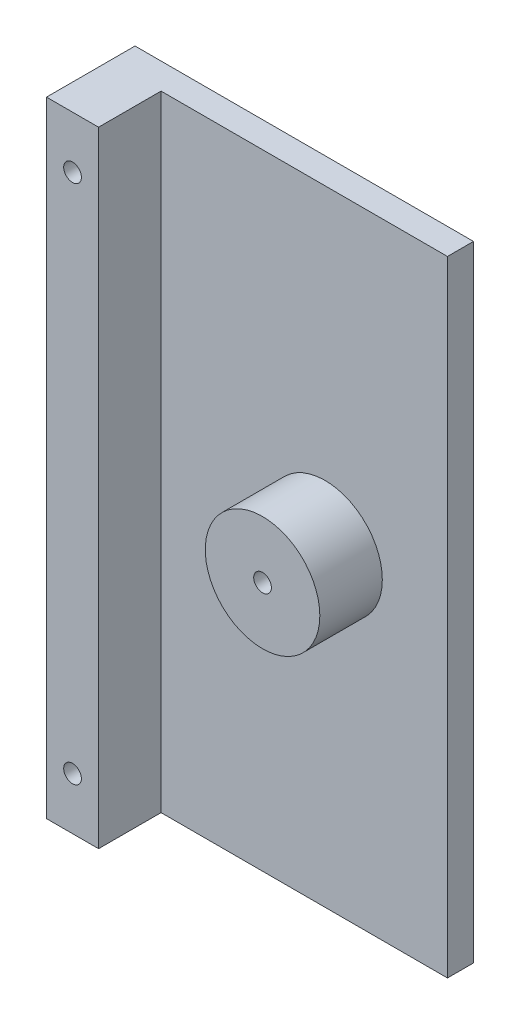
ISO-10303-21;
HEADER;
FILE_DESCRIPTION(('STEP AP214'),'2;1');
FILE_NAME('part.step','',(''),(''),'','','');
FILE_SCHEMA(('AUTOMOTIVE_DESIGN { 1 0 10303 214 1 1 1 1 }'));
ENDSEC;
DATA;
#1=APPLICATION_CONTEXT('core data for automotive mechanical design processes');
#2=APPLICATION_PROTOCOL_DEFINITION('international standard','automotive_design',2000,#1);
#3=PRODUCT_CONTEXT('',#1,'mechanical');
#4=PRODUCT('Part','Part','',(#3));
#5=PRODUCT_RELATED_PRODUCT_CATEGORY('part','',(#4));
#6=PRODUCT_DEFINITION_FORMATION('','',#4);
#7=PRODUCT_DEFINITION_CONTEXT('part definition',#1,'design');
#8=PRODUCT_DEFINITION('design','',#6,#7);
#9=PRODUCT_DEFINITION_SHAPE('','',#8);
#10=(LENGTH_UNIT() NAMED_UNIT(*) SI_UNIT(.MILLI.,.METRE.));
#11=(NAMED_UNIT(*) PLANE_ANGLE_UNIT() SI_UNIT($,.RADIAN.));
#12=(NAMED_UNIT(*) SI_UNIT($,.STERADIAN.) SOLID_ANGLE_UNIT());
#13=UNCERTAINTY_MEASURE_WITH_UNIT(LENGTH_MEASURE(1.E-05),#10,'distance_accuracy_value','');
#14=(GEOMETRIC_REPRESENTATION_CONTEXT(3) GLOBAL_UNCERTAINTY_ASSIGNED_CONTEXT((#13)) GLOBAL_UNIT_ASSIGNED_CONTEXT((#10,
#11,#12)) REPRESENTATION_CONTEXT('',''));
#15=CARTESIAN_POINT('',(0.,0.,0.));
#16=DIRECTION('',(0.,0.,1.));
#17=DIRECTION('',(1.,0.,0.));
#18=AXIS2_PLACEMENT_3D('',#15,#16,#17);
#19=CARTESIAN_POINT('',(8.99,0.,0.));
#20=DIRECTION('',(0.,0.,1.));
#21=DIRECTION('',(1.,0.,0.));
#22=AXIS2_PLACEMENT_3D('',#19,#20,#21);
#23=CYLINDRICAL_SURFACE('',#22,1.7);
#24=CARTESIAN_POINT('',(8.99,0.,17.));
#25=DIRECTION('',(0.,0.,1.));
#26=DIRECTION('',(1.,0.,0.));
#27=AXIS2_PLACEMENT_3D('',#24,#25,#26);
#28=CIRCLE('',#27,1.7);
#29=CARTESIAN_POINT('',(10.69,0.,17.));
#30=VERTEX_POINT('',#29);
#31=EDGE_CURVE('E186',#30,#30,#28,.T.);
#32=ORIENTED_EDGE('',*,*,#31,.T.);
#33=EDGE_LOOP('',(#32));
#34=FACE_BOUND('',#33,.T.);
#35=CARTESIAN_POINT('',(8.99,0.,2.6));
#36=DIRECTION('',(0.,0.,-1.));
#37=DIRECTION('',(-1.,0.,0.));
#38=AXIS2_PLACEMENT_3D('',#35,#36,#37);
#39=CIRCLE('',#38,1.7);
#40=CARTESIAN_POINT('',(7.29,0.,2.6));
#41=VERTEX_POINT('',#40);
#42=EDGE_CURVE('E45',#41,#41,#39,.F.);
#43=ORIENTED_EDGE('',*,*,#42,.F.);
#44=EDGE_LOOP('',(#43));
#45=FACE_BOUND('',#44,.T.);
#46=ADVANCED_FACE('F41',(#34,#45),#23,.F.);
#47=CARTESIAN_POINT('',(32.5,-60.,5.));
#48=DIRECTION('',(0.,1.,0.));
#49=DIRECTION('',(0.,0.,1.));
#50=AXIS2_PLACEMENT_3D('',#47,#48,#49);
#51=PLANE('',#50);
#52=DIRECTION('',(1.,0.,0.));
#53=VECTOR('',#52,1.);
#54=CARTESIAN_POINT('',(32.5,-60.,0.));
#55=LINE('',#54,#53);
#56=CARTESIAN_POINT('',(-32.5,-60.,0.));
#57=VERTEX_POINT('',#56);
#58=CARTESIAN_POINT('',(32.5,-60.,0.));
#59=VERTEX_POINT('',#58);
#60=EDGE_CURVE('E224',#57,#59,#55,.T.);
#61=ORIENTED_EDGE('',*,*,#60,.T.);
#62=DIRECTION('',(0.,0.,-1.));
#63=VECTOR('',#62,1.);
#64=CARTESIAN_POINT('',(32.5,-60.,5.));
#65=LINE('',#64,#63);
#66=CARTESIAN_POINT('',(32.5,-60.,5.));
#67=VERTEX_POINT('',#66);
#68=EDGE_CURVE('E11',#67,#59,#65,.T.);
#69=ORIENTED_EDGE('',*,*,#68,.F.);
#70=DIRECTION('',(1.,0.,0.));
#71=VECTOR('',#70,1.);
#72=CARTESIAN_POINT('',(32.5,-60.,5.));
#73=LINE('',#72,#71);
#74=CARTESIAN_POINT('',(-22.5,-60.,5.));
#75=VERTEX_POINT('',#74);
#76=EDGE_CURVE('E225',#75,#67,#73,.T.);
#77=ORIENTED_EDGE('',*,*,#76,.F.);
#78=DIRECTION('',(0.,0.,-1.));
#79=VECTOR('',#78,1.);
#80=CARTESIAN_POINT('',(-22.5,-60.,17.));
#81=LINE('',#80,#79);
#82=CARTESIAN_POINT('',(-22.5,-60.,17.));
#83=VERTEX_POINT('',#82);
#84=EDGE_CURVE('E221',#83,#75,#81,.T.);
#85=ORIENTED_EDGE('',*,*,#84,.F.);
#86=DIRECTION('',(1.,0.,0.));
#87=VECTOR('',#86,1.);
#88=CARTESIAN_POINT('',(-32.5,-60.,17.));
#89=LINE('',#88,#87);
#90=CARTESIAN_POINT('',(-32.5,-60.,17.));
#91=VERTEX_POINT('',#90);
#92=EDGE_CURVE('E210',#91,#83,#89,.T.);
#93=ORIENTED_EDGE('',*,*,#92,.F.);
#94=DIRECTION('',(0.,0.,-1.));
#95=VECTOR('',#94,1.);
#96=CARTESIAN_POINT('',(-32.5,-60.,5.));
#97=LINE('',#96,#95);
#98=EDGE_CURVE('E232',#91,#57,#97,.T.);
#99=ORIENTED_EDGE('',*,*,#98,.T.);
#100=EDGE_LOOP('',(#61,#69,#77,#85,#93,#99));
#101=FACE_BOUND('',#100,.T.);
#102=ADVANCED_FACE('F43',(#101),#51,.F.);
#103=CARTESIAN_POINT('',(32.5,60.,5.));
#104=DIRECTION('',(-1.,0.,0.));
#105=DIRECTION('',(0.,-1.,0.));
#106=AXIS2_PLACEMENT_3D('',#103,#104,#105);
#107=PLANE('',#106);
#108=DIRECTION('',(0.,1.,0.));
#109=VECTOR('',#108,1.);
#110=CARTESIAN_POINT('',(32.5,60.,0.));
#111=LINE('',#110,#109);
#112=CARTESIAN_POINT('',(32.5,60.,0.));
#113=VERTEX_POINT('',#112);
#114=EDGE_CURVE('E235',#59,#113,#111,.T.);
#115=ORIENTED_EDGE('',*,*,#114,.T.);
#116=DIRECTION('',(0.,0.,-1.));
#117=VECTOR('',#116,1.);
#118=CARTESIAN_POINT('',(32.5,60.,5.));
#119=LINE('',#118,#117);
#120=CARTESIAN_POINT('',(32.5,60.,5.));
#121=VERTEX_POINT('',#120);
#122=EDGE_CURVE('E50',#121,#113,#119,.T.);
#123=ORIENTED_EDGE('',*,*,#122,.F.);
#124=DIRECTION('',(0.,1.,0.));
#125=VECTOR('',#124,1.);
#126=CARTESIAN_POINT('',(32.5,60.,5.));
#127=LINE('',#126,#125);
#128=EDGE_CURVE('E227',#67,#121,#127,.T.);
#129=ORIENTED_EDGE('',*,*,#128,.F.);
#130=ORIENTED_EDGE('',*,*,#68,.T.);
#131=EDGE_LOOP('',(#115,#123,#129,#130));
#132=FACE_BOUND('',#131,.T.);
#133=ADVANCED_FACE('F293',(#132),#107,.F.);
#134=CARTESIAN_POINT('',(32.5,60.,5.));
#135=DIRECTION('',(0.,-1.,0.));
#136=DIRECTION('',(1.,0.,0.));
#137=AXIS2_PLACEMENT_3D('',#134,#135,#136);
#138=PLANE('',#137);
#139=DIRECTION('',(-1.,0.,0.));
#140=VECTOR('',#139,1.);
#141=CARTESIAN_POINT('',(32.5,60.,0.));
#142=LINE('',#141,#140);
#143=CARTESIAN_POINT('',(-32.5,60.,0.));
#144=VERTEX_POINT('',#143);
#145=EDGE_CURVE('E237',#113,#144,#142,.T.);
#146=ORIENTED_EDGE('',*,*,#145,.T.);
#147=DIRECTION('',(0.,0.,-1.));
#148=VECTOR('',#147,1.);
#149=CARTESIAN_POINT('',(-32.5,60.,5.));
#150=LINE('',#149,#148);
#151=CARTESIAN_POINT('',(-32.5,60.,17.));
#152=VERTEX_POINT('',#151);
#153=EDGE_CURVE('E242',#152,#144,#150,.T.);
#154=ORIENTED_EDGE('',*,*,#153,.F.);
#155=DIRECTION('',(-1.,0.,0.));
#156=VECTOR('',#155,1.);
#157=CARTESIAN_POINT('',(-32.5,60.,17.));
#158=LINE('',#157,#156);
#159=CARTESIAN_POINT('',(-22.5,60.,17.));
#160=VERTEX_POINT('',#159);
#161=EDGE_CURVE('E214',#160,#152,#158,.T.);
#162=ORIENTED_EDGE('',*,*,#161,.F.);
#163=DIRECTION('',(0.,0.,-1.));
#164=VECTOR('',#163,1.);
#165=CARTESIAN_POINT('',(-22.5,60.,17.));
#166=LINE('',#165,#164);
#167=CARTESIAN_POINT('',(-22.5,60.,5.));
#168=VERTEX_POINT('',#167);
#169=EDGE_CURVE('E217',#160,#168,#166,.T.);
#170=ORIENTED_EDGE('',*,*,#169,.T.);
#171=DIRECTION('',(-1.,0.,0.));
#172=VECTOR('',#171,1.);
#173=CARTESIAN_POINT('',(32.5,60.,5.));
#174=LINE('',#173,#172);
#175=EDGE_CURVE('E230',#121,#168,#174,.T.);
#176=ORIENTED_EDGE('',*,*,#175,.F.);
#177=ORIENTED_EDGE('',*,*,#122,.T.);
#178=EDGE_LOOP('',(#146,#154,#162,#170,#176,#177));
#179=FACE_BOUND('',#178,.T.);
#180=ADVANCED_FACE('F250',(#179),#138,.F.);
#181=CARTESIAN_POINT('',(-32.5,60.,5.));
#182=DIRECTION('',(1.,0.,0.));
#183=DIRECTION('',(0.,1.,0.));
#184=AXIS2_PLACEMENT_3D('',#181,#182,#183);
#185=PLANE('',#184);
#186=DIRECTION('',(0.,-1.,0.));
#187=VECTOR('',#186,1.);
#188=CARTESIAN_POINT('',(-32.5,60.,0.));
#189=LINE('',#188,#187);
#190=EDGE_CURVE('E228',#144,#57,#189,.T.);
#191=ORIENTED_EDGE('',*,*,#190,.T.);
#192=ORIENTED_EDGE('',*,*,#98,.F.);
#193=DIRECTION('',(0.,-1.,0.));
#194=VECTOR('',#193,1.);
#195=CARTESIAN_POINT('',(-32.5,60.,17.));
#196=LINE('',#195,#194);
#197=EDGE_CURVE('E207',#152,#91,#196,.T.);
#198=ORIENTED_EDGE('',*,*,#197,.F.);
#199=ORIENTED_EDGE('',*,*,#153,.T.);
#200=EDGE_LOOP('',(#191,#192,#198,#199));
#201=FACE_BOUND('',#200,.T.);
#202=ADVANCED_FACE('F258',(#201),#185,.F.);
#203=CARTESIAN_POINT('',(0.,0.,5.));
#204=DIRECTION('',(0.,0.,1.));
#205=DIRECTION('',(1.,0.,0.));
#206=AXIS2_PLACEMENT_3D('',#203,#204,#205);
#207=PLANE('',#206);
#208=CARTESIAN_POINT('',(8.99,0.,5.));
#209=DIRECTION('',(0.,0.,1.));
#210=DIRECTION('',(1.,0.,0.));
#211=AXIS2_PLACEMENT_3D('',#208,#209,#210);
#212=CIRCLE('',#211,11.);
#213=CARTESIAN_POINT('',(19.99,0.,5.));
#214=VERTEX_POINT('',#213);
#215=EDGE_CURVE('E201',#214,#214,#212,.T.);
#216=ORIENTED_EDGE('',*,*,#215,.F.);
#217=EDGE_LOOP('',(#216));
#218=FACE_BOUND('',#217,.T.);
#219=DIRECTION('',(0.,1.,0.));
#220=VECTOR('',#219,1.);
#221=CARTESIAN_POINT('',(-22.5,60.,5.));
#222=LINE('',#221,#220);
#223=EDGE_CURVE('E65',#75,#168,#222,.T.);
#224=ORIENTED_EDGE('',*,*,#223,.F.);
#225=ORIENTED_EDGE('',*,*,#76,.T.);
#226=ORIENTED_EDGE('',*,*,#128,.T.);
#227=ORIENTED_EDGE('',*,*,#175,.T.);
#228=EDGE_LOOP('',(#224,#225,#226,#227));
#229=FACE_BOUND('',#228,.T.);
#230=ADVANCED_FACE('F282',(#218,#229),#207,.T.);
#231=CARTESIAN_POINT('',(0.,0.,0.));
#232=DIRECTION('',(0.,0.,1.));
#233=DIRECTION('',(1.,0.,0.));
#234=AXIS2_PLACEMENT_3D('',#231,#232,#233);
#235=PLANE('',#234);
#236=DIRECTION('',(0.999905877551276,-0.0137199139360203,0.));
#237=VECTOR('',#236,1.);
#238=CARTESIAN_POINT('',(7.38380836114738,2.87230715963317,0.));
#239=LINE('',#238,#237);
#240=CARTESIAN_POINT('',(7.38380836114738,2.87230715963317,0.));
#241=VERTEX_POINT('',#240);
#242=CARTESIAN_POINT('',(10.6743951482879,2.82715634240911,0.));
#243=VERTEX_POINT('',#242);
#244=EDGE_CURVE('E167',#241,#243,#239,.T.);
#245=ORIENTED_EDGE('',*,*,#244,.F.);
#246=DIRECTION('',(0.511834732781968,0.859083934384767,0.));
#247=VECTOR('',#246,1.);
#248=CARTESIAN_POINT('',(5.69941321285944,0.0451508172240557,0.));
#249=LINE('',#248,#247);
#250=CARTESIAN_POINT('',(5.69941321285944,0.0451508172240557,0.));
#251=VERTEX_POINT('',#250);
#252=EDGE_CURVE('E57',#251,#241,#249,.T.);
#253=ORIENTED_EDGE('',*,*,#252,.F.);
#254=DIRECTION('',(-0.488071144769308,0.872803848320788,0.));
#255=VECTOR('',#254,1.);
#256=CARTESIAN_POINT('',(7.30560485171207,-2.82715634240911,0.));
#257=LINE('',#256,#255);
#258=CARTESIAN_POINT('',(7.30560485171207,-2.82715634240911,0.));
#259=VERTEX_POINT('',#258);
#260=EDGE_CURVE('E153',#259,#251,#257,.T.);
#261=ORIENTED_EDGE('',*,*,#260,.F.);
#262=DIRECTION('',(-0.999905877551276,0.0137199139360204,0.));
#263=VECTOR('',#262,1.);
#264=CARTESIAN_POINT('',(10.5961916388526,-2.87230715963317,0.));
#265=LINE('',#264,#263);
#266=CARTESIAN_POINT('',(10.5961916388526,-2.87230715963317,0.));
#267=VERTEX_POINT('',#266);
#268=EDGE_CURVE('E156',#267,#259,#265,.T.);
#269=ORIENTED_EDGE('',*,*,#268,.F.);
#270=DIRECTION('',(-0.511834732781968,-0.859083934384768,0.));
#271=VECTOR('',#270,1.);
#272=CARTESIAN_POINT('',(12.2805867871405,-0.0451508172240537,0.));
#273=LINE('',#272,#271);
#274=CARTESIAN_POINT('',(12.2805867871405,-0.0451508172240537,0.));
#275=VERTEX_POINT('',#274);
#276=EDGE_CURVE('E172',#275,#267,#273,.T.);
#277=ORIENTED_EDGE('',*,*,#276,.F.);
#278=DIRECTION('',(0.488071144769308,-0.872803848320788,0.));
#279=VECTOR('',#278,1.);
#280=CARTESIAN_POINT('',(10.6743951482879,2.82715634240911,0.));
#281=LINE('',#280,#279);
#282=EDGE_CURVE('E169',#243,#275,#281,.T.);
#283=ORIENTED_EDGE('',*,*,#282,.F.);
#284=EDGE_LOOP('',(#245,#253,#261,#269,#277,#283));
#285=FACE_BOUND('',#284,.T.);
#286=CARTESIAN_POINT('',(-27.5,50.,0.));
#287=DIRECTION('',(0.,0.,1.));
#288=DIRECTION('',(1.,0.,0.));
#289=AXIS2_PLACEMENT_3D('',#286,#287,#288);
#290=CIRCLE('',#289,1.7);
#291=CARTESIAN_POINT('',(-25.8,50.,0.));
#292=VERTEX_POINT('',#291);
#293=EDGE_CURVE('E198',#292,#292,#290,.T.);
#294=ORIENTED_EDGE('',*,*,#293,.T.);
#295=EDGE_LOOP('',(#294));
#296=FACE_BOUND('',#295,.T.);
#297=CARTESIAN_POINT('',(-27.5,-50.,0.));
#298=DIRECTION('',(0.,0.,1.));
#299=DIRECTION('',(1.,0.,0.));
#300=AXIS2_PLACEMENT_3D('',#297,#298,#299);
#301=CIRCLE('',#300,1.7);
#302=CARTESIAN_POINT('',(-25.8,-50.,0.));
#303=VERTEX_POINT('',#302);
#304=EDGE_CURVE('E193',#303,#303,#301,.T.);
#305=ORIENTED_EDGE('',*,*,#304,.T.);
#306=EDGE_LOOP('',(#305));
#307=FACE_BOUND('',#306,.T.);
#308=ORIENTED_EDGE('',*,*,#60,.F.);
#309=ORIENTED_EDGE('',*,*,#190,.F.);
#310=ORIENTED_EDGE('',*,*,#145,.F.);
#311=ORIENTED_EDGE('',*,*,#114,.F.);
#312=EDGE_LOOP('',(#308,#309,#310,#311));
#313=FACE_BOUND('',#312,.T.);
#314=ADVANCED_FACE('F256',(#285,#296,#307,#313),#235,.F.);
#315=CARTESIAN_POINT('',(-22.5,60.,17.));
#316=DIRECTION('',(-1.,0.,0.));
#317=DIRECTION('',(0.,-1.,0.));
#318=AXIS2_PLACEMENT_3D('',#315,#316,#317);
#319=PLANE('',#318);
#320=ORIENTED_EDGE('',*,*,#223,.T.);
#321=ORIENTED_EDGE('',*,*,#169,.F.);
#322=DIRECTION('',(0.,1.,0.));
#323=VECTOR('',#322,1.);
#324=CARTESIAN_POINT('',(-22.5,60.,17.));
#325=LINE('',#324,#323);
#326=EDGE_CURVE('E212',#83,#160,#325,.T.);
#327=ORIENTED_EDGE('',*,*,#326,.F.);
#328=ORIENTED_EDGE('',*,*,#84,.T.);
#329=EDGE_LOOP('',(#320,#321,#327,#328));
#330=FACE_BOUND('',#329,.T.);
#331=ADVANCED_FACE('F270',(#330),#319,.F.);
#332=CARTESIAN_POINT('',(0.,0.,17.));
#333=DIRECTION('',(0.,0.,1.));
#334=DIRECTION('',(1.,0.,0.));
#335=AXIS2_PLACEMENT_3D('',#332,#333,#334);
#336=PLANE('',#335);
#337=CARTESIAN_POINT('',(-27.5,50.,17.));
#338=DIRECTION('',(0.,0.,1.));
#339=DIRECTION('',(1.,0.,0.));
#340=AXIS2_PLACEMENT_3D('',#337,#338,#339);
#341=CIRCLE('',#340,1.7);
#342=CARTESIAN_POINT('',(-25.8,50.,17.));
#343=VERTEX_POINT('',#342);
#344=EDGE_CURVE('E190',#343,#343,#341,.T.);
#345=ORIENTED_EDGE('',*,*,#344,.F.);
#346=EDGE_LOOP('',(#345));
#347=FACE_BOUND('',#346,.T.);
#348=CARTESIAN_POINT('',(-27.5,-50.,17.));
#349=DIRECTION('',(0.,0.,1.));
#350=DIRECTION('',(1.,0.,0.));
#351=AXIS2_PLACEMENT_3D('',#348,#349,#350);
#352=CIRCLE('',#351,1.7);
#353=CARTESIAN_POINT('',(-25.8,-50.,17.));
#354=VERTEX_POINT('',#353);
#355=EDGE_CURVE('E189',#354,#354,#352,.T.);
#356=ORIENTED_EDGE('',*,*,#355,.F.);
#357=EDGE_LOOP('',(#356));
#358=FACE_BOUND('',#357,.T.);
#359=ORIENTED_EDGE('',*,*,#197,.T.);
#360=ORIENTED_EDGE('',*,*,#92,.T.);
#361=ORIENTED_EDGE('',*,*,#326,.T.);
#362=ORIENTED_EDGE('',*,*,#161,.T.);
#363=EDGE_LOOP('',(#359,#360,#361,#362));
#364=FACE_BOUND('',#363,.T.);
#365=ADVANCED_FACE('F266',(#347,#358,#364),#336,.T.);
#366=CARTESIAN_POINT('',(8.99,0.,17.));
#367=DIRECTION('',(0.,0.,-1.));
#368=DIRECTION('',(-1.,0.,0.));
#369=AXIS2_PLACEMENT_3D('',#366,#367,#368);
#370=CYLINDRICAL_SURFACE('',#369,11.);
#371=CARTESIAN_POINT('',(8.99,0.,17.));
#372=DIRECTION('',(0.,0.,1.));
#373=DIRECTION('',(1.,0.,0.));
#374=AXIS2_PLACEMENT_3D('',#371,#372,#373);
#375=CIRCLE('',#374,11.);
#376=CARTESIAN_POINT('',(19.99,0.,17.));
#377=VERTEX_POINT('',#376);
#378=EDGE_CURVE('E202',#377,#377,#375,.T.);
#379=ORIENTED_EDGE('',*,*,#378,.F.);
#380=EDGE_LOOP('',(#379));
#381=FACE_BOUND('',#380,.T.);
#382=ORIENTED_EDGE('',*,*,#215,.T.);
#383=EDGE_LOOP('',(#382));
#384=FACE_BOUND('',#383,.T.);
#385=ADVANCED_FACE('F278',(#381,#384),#370,.T.);
#386=CARTESIAN_POINT('',(8.99,0.,17.));
#387=DIRECTION('',(0.,0.,1.));
#388=DIRECTION('',(1.,0.,0.));
#389=AXIS2_PLACEMENT_3D('',#386,#387,#388);
#390=PLANE('',#389);
#391=ORIENTED_EDGE('',*,*,#31,.F.);
#392=EDGE_LOOP('',(#391));
#393=FACE_BOUND('',#392,.T.);
#394=ORIENTED_EDGE('',*,*,#378,.T.);
#395=EDGE_LOOP('',(#394));
#396=FACE_BOUND('',#395,.T.);
#397=ADVANCED_FACE('F305',(#393,#396),#390,.T.);
#398=CARTESIAN_POINT('',(-27.5,-50.,-5.));
#399=DIRECTION('',(0.,0.,1.));
#400=DIRECTION('',(1.,0.,0.));
#401=AXIS2_PLACEMENT_3D('',#398,#399,#400);
#402=CYLINDRICAL_SURFACE('',#401,1.7);
#403=ORIENTED_EDGE('',*,*,#355,.T.);
#404=EDGE_LOOP('',(#403));
#405=FACE_BOUND('',#404,.T.);
#406=ORIENTED_EDGE('',*,*,#304,.F.);
#407=EDGE_LOOP('',(#406));
#408=FACE_BOUND('',#407,.T.);
#409=ADVANCED_FACE('F301',(#405,#408),#402,.F.);
#410=CARTESIAN_POINT('',(-27.5,50.,-5.));
#411=DIRECTION('',(0.,0.,1.));
#412=DIRECTION('',(1.,0.,0.));
#413=AXIS2_PLACEMENT_3D('',#410,#411,#412);
#414=CYLINDRICAL_SURFACE('',#413,1.7);
#415=ORIENTED_EDGE('',*,*,#344,.T.);
#416=EDGE_LOOP('',(#415));
#417=FACE_BOUND('',#416,.T.);
#418=ORIENTED_EDGE('',*,*,#293,.F.);
#419=EDGE_LOOP('',(#418));
#420=FACE_BOUND('',#419,.T.);
#421=ADVANCED_FACE('F298',(#417,#420),#414,.F.);
#422=CARTESIAN_POINT('',(0.,0.,2.6));
#423=DIRECTION('',(0.,0.,-1.));
#424=DIRECTION('',(-1.,0.,0.));
#425=AXIS2_PLACEMENT_3D('',#422,#423,#424);
#426=PLANE('',#425);
#427=DIRECTION('',(0.511834732781968,0.859083934384767,0.));
#428=VECTOR('',#427,1.);
#429=CARTESIAN_POINT('',(5.69941321285944,0.0451508172240557,2.6));
#430=LINE('',#429,#428);
#431=CARTESIAN_POINT('',(5.69941321285944,0.0451508172240557,2.6));
#432=VERTEX_POINT('',#431);
#433=CARTESIAN_POINT('',(7.38380836114738,2.87230715963317,2.6));
#434=VERTEX_POINT('',#433);
#435=EDGE_CURVE('E133',#432,#434,#430,.T.);
#436=ORIENTED_EDGE('',*,*,#435,.T.);
#437=DIRECTION('',(0.999905877551276,-0.0137199139360203,0.));
#438=VECTOR('',#437,1.);
#439=CARTESIAN_POINT('',(7.38380836114738,2.87230715963317,2.6));
#440=LINE('',#439,#438);
#441=CARTESIAN_POINT('',(10.6743951482879,2.82715634240911,2.6));
#442=VERTEX_POINT('',#441);
#443=EDGE_CURVE('E142',#434,#442,#440,.T.);
#444=ORIENTED_EDGE('',*,*,#443,.T.);
#445=DIRECTION('',(0.488071144769308,-0.872803848320788,0.));
#446=VECTOR('',#445,1.);
#447=CARTESIAN_POINT('',(10.6743951482879,2.82715634240911,2.6));
#448=LINE('',#447,#446);
#449=CARTESIAN_POINT('',(12.2805867871405,-0.0451508172240537,2.6));
#450=VERTEX_POINT('',#449);
#451=EDGE_CURVE('E147',#442,#450,#448,.T.);
#452=ORIENTED_EDGE('',*,*,#451,.T.);
#453=DIRECTION('',(-0.511834732781968,-0.859083934384768,0.));
#454=VECTOR('',#453,1.);
#455=CARTESIAN_POINT('',(12.2805867871405,-0.0451508172240537,2.6));
#456=LINE('',#455,#454);
#457=CARTESIAN_POINT('',(10.5961916388526,-2.87230715963317,2.6));
#458=VERTEX_POINT('',#457);
#459=EDGE_CURVE('E160',#450,#458,#456,.T.);
#460=ORIENTED_EDGE('',*,*,#459,.T.);
#461=DIRECTION('',(-0.999905877551276,0.0137199139360204,0.));
#462=VECTOR('',#461,1.);
#463=CARTESIAN_POINT('',(10.5961916388526,-2.87230715963317,2.6));
#464=LINE('',#463,#462);
#465=CARTESIAN_POINT('',(7.30560485171207,-2.82715634240911,2.6));
#466=VERTEX_POINT('',#465);
#467=EDGE_CURVE('E163',#458,#466,#464,.T.);
#468=ORIENTED_EDGE('',*,*,#467,.T.);
#469=DIRECTION('',(-0.488071144769308,0.872803848320788,0.));
#470=VECTOR('',#469,1.);
#471=CARTESIAN_POINT('',(7.30560485171207,-2.82715634240911,2.6));
#472=LINE('',#471,#470);
#473=EDGE_CURVE('E139',#466,#432,#472,.T.);
#474=ORIENTED_EDGE('',*,*,#473,.T.);
#475=EDGE_LOOP('',(#436,#444,#452,#460,#468,#474));
#476=FACE_BOUND('',#475,.T.);
#477=ORIENTED_EDGE('',*,*,#42,.T.);
#478=EDGE_LOOP('',(#477));
#479=FACE_BOUND('',#478,.T.);
#480=ADVANCED_FACE('F149',(#476,#479),#426,.T.);
#481=CARTESIAN_POINT('',(5.69941321285944,0.0451508172240557,2.6));
#482=DIRECTION('',(-0.859083934384768,0.511834732781968,0.));
#483=DIRECTION('',(-0.511834732781968,-0.859083934384768,0.));
#484=AXIS2_PLACEMENT_3D('',#481,#482,#483);
#485=PLANE('',#484);
#486=ORIENTED_EDGE('',*,*,#252,.T.);
#487=DIRECTION('',(0.,0.,-1.));
#488=VECTOR('',#487,1.);
#489=CARTESIAN_POINT('',(7.38380836114738,2.87230715963317,2.6));
#490=LINE('',#489,#488);
#491=EDGE_CURVE('E129',#434,#241,#490,.T.);
#492=ORIENTED_EDGE('',*,*,#491,.F.);
#493=ORIENTED_EDGE('',*,*,#435,.F.);
#494=DIRECTION('',(0.,0.,-1.));
#495=VECTOR('',#494,1.);
#496=CARTESIAN_POINT('',(5.69941321285944,0.0451508172240557,2.6));
#497=LINE('',#496,#495);
#498=EDGE_CURVE('E177',#432,#251,#497,.T.);
#499=ORIENTED_EDGE('',*,*,#498,.T.);
#500=EDGE_LOOP('',(#486,#492,#493,#499));
#501=FACE_BOUND('',#500,.T.);
#502=ADVANCED_FACE('F131',(#501),#485,.F.);
#503=CARTESIAN_POINT('',(7.30560485171207,-2.82715634240911,2.6));
#504=DIRECTION('',(-0.872803848320788,-0.488071144769308,0.));
#505=DIRECTION('',(0.488071144769308,-0.872803848320788,0.));
#506=AXIS2_PLACEMENT_3D('',#503,#504,#505);
#507=PLANE('',#506);
#508=ORIENTED_EDGE('',*,*,#260,.T.);
#509=ORIENTED_EDGE('',*,*,#498,.F.);
#510=ORIENTED_EDGE('',*,*,#473,.F.);
#511=DIRECTION('',(0.,0.,-1.));
#512=VECTOR('',#511,1.);
#513=CARTESIAN_POINT('',(7.30560485171207,-2.82715634240911,2.6));
#514=LINE('',#513,#512);
#515=EDGE_CURVE('E179',#466,#259,#514,.T.);
#516=ORIENTED_EDGE('',*,*,#515,.T.);
#517=EDGE_LOOP('',(#508,#509,#510,#516));
#518=FACE_BOUND('',#517,.T.);
#519=ADVANCED_FACE('F398',(#518),#507,.F.);
#520=CARTESIAN_POINT('',(10.5961916388526,-2.87230715963317,2.6));
#521=DIRECTION('',(-0.0137199139360204,-0.999905877551276,0.));
#522=DIRECTION('',(0.999905877551276,-0.0137199139360204,0.));
#523=AXIS2_PLACEMENT_3D('',#520,#521,#522);
#524=PLANE('',#523);
#525=ORIENTED_EDGE('',*,*,#268,.T.);
#526=ORIENTED_EDGE('',*,*,#515,.F.);
#527=ORIENTED_EDGE('',*,*,#467,.F.);
#528=DIRECTION('',(0.,0.,-1.));
#529=VECTOR('',#528,1.);
#530=CARTESIAN_POINT('',(10.5961916388526,-2.87230715963317,2.6));
#531=LINE('',#530,#529);
#532=EDGE_CURVE('E181',#458,#267,#531,.T.);
#533=ORIENTED_EDGE('',*,*,#532,.T.);
#534=EDGE_LOOP('',(#525,#526,#527,#533));
#535=FACE_BOUND('',#534,.T.);
#536=ADVANCED_FACE('F406',(#535),#524,.F.);
#537=CARTESIAN_POINT('',(12.2805867871405,-0.0451508172240537,2.6));
#538=DIRECTION('',(0.859083934384768,-0.511834732781968,0.));
#539=DIRECTION('',(0.511834732781968,0.859083934384768,0.));
#540=AXIS2_PLACEMENT_3D('',#537,#538,#539);
#541=PLANE('',#540);
#542=ORIENTED_EDGE('',*,*,#276,.T.);
#543=ORIENTED_EDGE('',*,*,#532,.F.);
#544=ORIENTED_EDGE('',*,*,#459,.F.);
#545=DIRECTION('',(0.,0.,-1.));
#546=VECTOR('',#545,1.);
#547=CARTESIAN_POINT('',(12.2805867871405,-0.0451508172240537,2.6));
#548=LINE('',#547,#546);
#549=EDGE_CURVE('E183',#450,#275,#548,.T.);
#550=ORIENTED_EDGE('',*,*,#549,.T.);
#551=EDGE_LOOP('',(#542,#543,#544,#550));
#552=FACE_BOUND('',#551,.T.);
#553=ADVANCED_FACE('F416',(#552),#541,.F.);
#554=CARTESIAN_POINT('',(10.6743951482879,2.82715634240911,2.6));
#555=DIRECTION('',(0.872803848320788,0.488071144769308,0.));
#556=DIRECTION('',(-0.488071144769308,0.872803848320788,0.));
#557=AXIS2_PLACEMENT_3D('',#554,#555,#556);
#558=PLANE('',#557);
#559=ORIENTED_EDGE('',*,*,#282,.T.);
#560=ORIENTED_EDGE('',*,*,#549,.F.);
#561=ORIENTED_EDGE('',*,*,#451,.F.);
#562=DIRECTION('',(0.,0.,-1.));
#563=VECTOR('',#562,1.);
#564=CARTESIAN_POINT('',(10.6743951482879,2.82715634240911,2.6));
#565=LINE('',#564,#563);
#566=EDGE_CURVE('E138',#442,#243,#565,.T.);
#567=ORIENTED_EDGE('',*,*,#566,.T.);
#568=EDGE_LOOP('',(#559,#560,#561,#567));
#569=FACE_BOUND('',#568,.T.);
#570=ADVANCED_FACE('F426',(#569),#558,.F.);
#571=CARTESIAN_POINT('',(7.38380836114738,2.87230715963317,2.6));
#572=DIRECTION('',(0.0137199139360203,0.999905877551276,0.));
#573=DIRECTION('',(-0.999905877551276,0.0137199139360203,0.));
#574=AXIS2_PLACEMENT_3D('',#571,#572,#573);
#575=PLANE('',#574);
#576=ORIENTED_EDGE('',*,*,#244,.T.);
#577=ORIENTED_EDGE('',*,*,#566,.F.);
#578=ORIENTED_EDGE('',*,*,#443,.F.);
#579=ORIENTED_EDGE('',*,*,#491,.T.);
#580=EDGE_LOOP('',(#576,#577,#578,#579));
#581=FACE_BOUND('',#580,.T.);
#582=ADVANCED_FACE('F143',(#581),#575,.F.);
#583=CLOSED_SHELL('',(#46,#102,#133,#180,#202,#230,#314,#331,#365,#385,#397,#409,#421,#480,#502,
#519,#536,#553,#570,#582));
#584=MANIFOLD_SOLID_BREP('B2',#583);
#585=ADVANCED_BREP_SHAPE_REPRESENTATION('',(#18,#584),#14);
#586=SHAPE_DEFINITION_REPRESENTATION(#9,#585);
ENDSEC;
END-ISO-10303-21;
